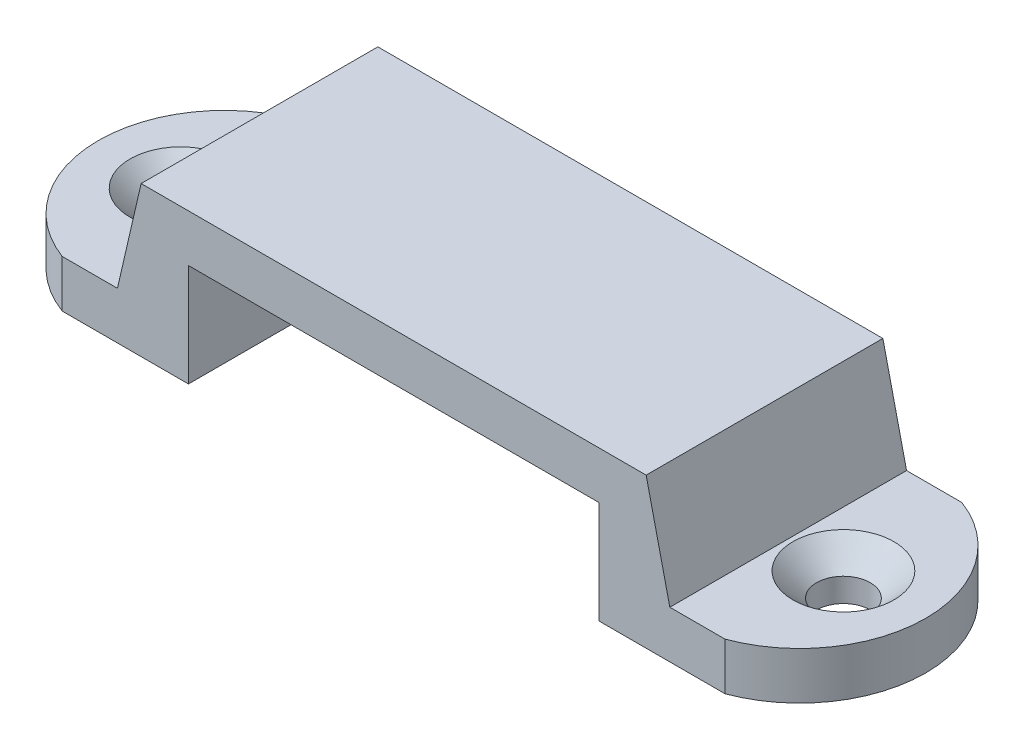
ISO-10303-21;
HEADER;
FILE_DESCRIPTION(('STEP AP214'),'2;1');
FILE_NAME('part.step','',(''),(''),'','','');
FILE_SCHEMA(('AUTOMOTIVE_DESIGN { 1 0 10303 214 1 1 1 1 }'));
ENDSEC;
DATA;
#1=APPLICATION_CONTEXT('core data for automotive mechanical design processes');
#2=APPLICATION_PROTOCOL_DEFINITION('international standard','automotive_design',2000,#1);
#3=PRODUCT_CONTEXT('',#1,'mechanical');
#4=PRODUCT('Part','Part','',(#3));
#5=PRODUCT_RELATED_PRODUCT_CATEGORY('part','',(#4));
#6=PRODUCT_DEFINITION_FORMATION('','',#4);
#7=PRODUCT_DEFINITION_CONTEXT('part definition',#1,'design');
#8=PRODUCT_DEFINITION('design','',#6,#7);
#9=PRODUCT_DEFINITION_SHAPE('','',#8);
#10=(LENGTH_UNIT() NAMED_UNIT(*) SI_UNIT(.MILLI.,.METRE.));
#11=(NAMED_UNIT(*) PLANE_ANGLE_UNIT() SI_UNIT($,.RADIAN.));
#12=(NAMED_UNIT(*) SI_UNIT($,.STERADIAN.) SOLID_ANGLE_UNIT());
#13=UNCERTAINTY_MEASURE_WITH_UNIT(LENGTH_MEASURE(1.E-05),#10,'distance_accuracy_value','');
#14=(GEOMETRIC_REPRESENTATION_CONTEXT(3) GLOBAL_UNCERTAINTY_ASSIGNED_CONTEXT((#13)) GLOBAL_UNIT_ASSIGNED_CONTEXT((#10,
#11,#12)) REPRESENTATION_CONTEXT('',''));
#15=CARTESIAN_POINT('',(0.,0.,0.));
#16=DIRECTION('',(0.,0.,1.));
#17=DIRECTION('',(1.,0.,0.));
#18=AXIS2_PLACEMENT_3D('',#15,#16,#17);
#19=CARTESIAN_POINT('',(4.5,-3.00000000000001,15.));
#20=DIRECTION('',(0.,1.,0.));
#21=DIRECTION('',(-1.,0.,0.));
#22=AXIS2_PLACEMENT_3D('',#19,#20,#21);
#23=PLANE('',#22);
#24=CARTESIAN_POINT('',(-3.5,-3.00000000000001,7.49999999999996));
#25=DIRECTION('',(0.,1.,0.));
#26=DIRECTION('',(-1.,0.,0.));
#27=AXIS2_PLACEMENT_3D('',#24,#25,#26);
#28=CIRCLE('',#27,1.69999999999999);
#29=CARTESIAN_POINT('',(-5.19999999999999,-3.00000000000001,7.49999999999996));
#30=VERTEX_POINT('',#29);
#31=EDGE_CURVE('E36',#30,#30,#28,.T.);
#32=ORIENTED_EDGE('',*,*,#31,.T.);
#33=EDGE_LOOP('',(#32));
#34=FACE_BOUND('',#33,.T.);
#35=DIRECTION('',(1.,0.,0.));
#36=VECTOR('',#35,1.);
#37=CARTESIAN_POINT('',(4.5,-3.00000000000001,0.));
#38=LINE('',#37,#36);
#39=CARTESIAN_POINT('',(-3.5,-3.00000000000001,0.));
#40=VERTEX_POINT('',#39);
#41=CARTESIAN_POINT('',(4.5,-3.00000000000001,0.));
#42=VERTEX_POINT('',#41);
#43=EDGE_CURVE('E148',#40,#42,#38,.T.);
#44=ORIENTED_EDGE('',*,*,#43,.T.);
#45=DIRECTION('',(0.,0.,-1.));
#46=VECTOR('',#45,1.);
#47=CARTESIAN_POINT('',(4.5,-3.00000000000001,15.));
#48=LINE('',#47,#46);
#49=CARTESIAN_POINT('',(4.5,-3.00000000000001,15.));
#50=VERTEX_POINT('',#49);
#51=EDGE_CURVE('E11',#50,#42,#48,.T.);
#52=ORIENTED_EDGE('',*,*,#51,.F.);
#53=DIRECTION('',(1.,0.,0.));
#54=VECTOR('',#53,1.);
#55=CARTESIAN_POINT('',(4.5,-3.00000000000001,15.));
#56=LINE('',#55,#54);
#57=CARTESIAN_POINT('',(-3.5,-3.00000000000001,15.));
#58=VERTEX_POINT('',#57);
#59=EDGE_CURVE('E173',#58,#50,#56,.T.);
#60=ORIENTED_EDGE('',*,*,#59,.F.);
#61=CARTESIAN_POINT('',(-0.716117818584988,-3.00000000000001,7.5));
#62=DIRECTION('',(0.,1.,0.));
#63=DIRECTION('',(-1.,0.,0.));
#64=AXIS2_PLACEMENT_3D('',#61,#62,#63);
#65=CIRCLE('',#64,8.);
#66=EDGE_CURVE('E152',#58,#40,#65,.F.);
#67=ORIENTED_EDGE('',*,*,#66,.T.);
#68=EDGE_LOOP('',(#44,#52,#60,#67));
#69=FACE_BOUND('',#68,.T.);
#70=ADVANCED_FACE('F33',(#34,#69),#23,.F.);
#71=CARTESIAN_POINT('',(4.5,3.49999999999999,15.));
#72=DIRECTION('',(-1.,0.,0.));
#73=DIRECTION('',(0.,-1.,0.));
#74=AXIS2_PLACEMENT_3D('',#71,#72,#73);
#75=PLANE('',#74);
#76=DIRECTION('',(0.,1.,0.));
#77=VECTOR('',#76,1.);
#78=CARTESIAN_POINT('',(4.5,3.49999999999999,0.));
#79=LINE('',#78,#77);
#80=CARTESIAN_POINT('',(4.5,3.49999999999999,0.));
#81=VERTEX_POINT('',#80);
#82=EDGE_CURVE('E151',#42,#81,#79,.T.);
#83=ORIENTED_EDGE('',*,*,#82,.T.);
#84=DIRECTION('',(0.,0.,-1.));
#85=VECTOR('',#84,1.);
#86=CARTESIAN_POINT('',(4.5,3.49999999999999,15.));
#87=LINE('',#86,#85);
#88=CARTESIAN_POINT('',(4.5,3.49999999999999,15.));
#89=VERTEX_POINT('',#88);
#90=EDGE_CURVE('E42',#89,#81,#87,.T.);
#91=ORIENTED_EDGE('',*,*,#90,.F.);
#92=DIRECTION('',(0.,1.,0.));
#93=VECTOR('',#92,1.);
#94=CARTESIAN_POINT('',(4.5,3.49999999999999,15.));
#95=LINE('',#94,#93);
#96=EDGE_CURVE('E102',#50,#89,#95,.T.);
#97=ORIENTED_EDGE('',*,*,#96,.F.);
#98=ORIENTED_EDGE('',*,*,#51,.T.);
#99=EDGE_LOOP('',(#83,#91,#97,#98));
#100=FACE_BOUND('',#99,.T.);
#101=ADVANCED_FACE('F267',(#100),#75,.F.);
#102=CARTESIAN_POINT('',(30.5,3.49999999999999,15.));
#103=DIRECTION('',(0.,1.,0.));
#104=DIRECTION('',(0.,0.,1.));
#105=AXIS2_PLACEMENT_3D('',#102,#103,#104);
#106=PLANE('',#105);
#107=DIRECTION('',(1.,0.,0.));
#108=VECTOR('',#107,1.);
#109=CARTESIAN_POINT('',(30.5,3.49999999999999,0.));
#110=LINE('',#109,#108);
#111=CARTESIAN_POINT('',(30.5,3.49999999999999,0.));
#112=VERTEX_POINT('',#111);
#113=EDGE_CURVE('E154',#81,#112,#110,.T.);
#114=ORIENTED_EDGE('',*,*,#113,.T.);
#115=DIRECTION('',(0.,0.,-1.));
#116=VECTOR('',#115,1.);
#117=CARTESIAN_POINT('',(30.5,3.49999999999999,15.));
#118=LINE('',#117,#116);
#119=CARTESIAN_POINT('',(30.5,3.49999999999999,15.));
#120=VERTEX_POINT('',#119);
#121=EDGE_CURVE('E185',#120,#112,#118,.T.);
#122=ORIENTED_EDGE('',*,*,#121,.F.);
#123=DIRECTION('',(1.,0.,0.));
#124=VECTOR('',#123,1.);
#125=CARTESIAN_POINT('',(30.5,3.49999999999999,15.));
#126=LINE('',#125,#124);
#127=EDGE_CURVE('E214',#89,#120,#126,.T.);
#128=ORIENTED_EDGE('',*,*,#127,.F.);
#129=ORIENTED_EDGE('',*,*,#90,.T.);
#130=EDGE_LOOP('',(#114,#122,#128,#129));
#131=FACE_BOUND('',#130,.T.);
#132=ADVANCED_FACE('F272',(#131),#106,.F.);
#133=CARTESIAN_POINT('',(30.5,-3.00000000000001,15.));
#134=DIRECTION('',(1.,0.,0.));
#135=DIRECTION('',(0.,0.,-1.));
#136=AXIS2_PLACEMENT_3D('',#133,#134,#135);
#137=PLANE('',#136);
#138=DIRECTION('',(0.,-1.,0.));
#139=VECTOR('',#138,1.);
#140=CARTESIAN_POINT('',(30.5,-3.00000000000001,0.));
#141=LINE('',#140,#139);
#142=CARTESIAN_POINT('',(30.5,-3.00000000000001,0.));
#143=VERTEX_POINT('',#142);
#144=EDGE_CURVE('E156',#112,#143,#141,.T.);
#145=ORIENTED_EDGE('',*,*,#144,.T.);
#146=DIRECTION('',(0.,0.,-1.));
#147=VECTOR('',#146,1.);
#148=CARTESIAN_POINT('',(30.5,-3.00000000000001,15.));
#149=LINE('',#148,#147);
#150=CARTESIAN_POINT('',(30.5,-3.00000000000001,15.));
#151=VERTEX_POINT('',#150);
#152=EDGE_CURVE('E182',#151,#143,#149,.T.);
#153=ORIENTED_EDGE('',*,*,#152,.F.);
#154=DIRECTION('',(0.,-1.,0.));
#155=VECTOR('',#154,1.);
#156=CARTESIAN_POINT('',(30.5,-3.00000000000001,15.));
#157=LINE('',#156,#155);
#158=EDGE_CURVE('E216',#120,#151,#157,.T.);
#159=ORIENTED_EDGE('',*,*,#158,.F.);
#160=ORIENTED_EDGE('',*,*,#121,.T.);
#161=EDGE_LOOP('',(#145,#153,#159,#160));
#162=FACE_BOUND('',#161,.T.);
#163=ADVANCED_FACE('F263',(#162),#137,.F.);
#164=CARTESIAN_POINT('',(38.5,-3.00000000000001,15.));
#165=DIRECTION('',(0.,1.,0.));
#166=DIRECTION('',(-1.,0.,0.));
#167=AXIS2_PLACEMENT_3D('',#164,#165,#166);
#168=PLANE('',#167);
#169=CARTESIAN_POINT('',(38.5,-3.00000000000001,7.5));
#170=DIRECTION('',(0.,1.,0.));
#171=DIRECTION('',(-1.,0.,0.));
#172=AXIS2_PLACEMENT_3D('',#169,#170,#171);
#173=CIRCLE('',#172,1.69999999999999);
#174=CARTESIAN_POINT('',(36.8,-3.00000000000001,7.5));
#175=VERTEX_POINT('',#174);
#176=EDGE_CURVE('E189',#175,#175,#173,.T.);
#177=ORIENTED_EDGE('',*,*,#176,.T.);
#178=EDGE_LOOP('',(#177));
#179=FACE_BOUND('',#178,.T.);
#180=DIRECTION('',(1.,0.,0.));
#181=VECTOR('',#180,1.);
#182=CARTESIAN_POINT('',(38.5,-3.00000000000001,0.));
#183=LINE('',#182,#181);
#184=CARTESIAN_POINT('',(38.5,-3.00000000000001,0.));
#185=VERTEX_POINT('',#184);
#186=EDGE_CURVE('E158',#143,#185,#183,.T.);
#187=ORIENTED_EDGE('',*,*,#186,.T.);
#188=CARTESIAN_POINT('',(35.716117818585,-3.00000000000001,7.5));
#189=DIRECTION('',(0.,1.,0.));
#190=DIRECTION('',(-1.,0.,0.));
#191=AXIS2_PLACEMENT_3D('',#188,#189,#190);
#192=CIRCLE('',#191,8.);
#193=CARTESIAN_POINT('',(38.5,-3.00000000000001,15.));
#194=VERTEX_POINT('',#193);
#195=EDGE_CURVE('E196',#185,#194,#192,.F.);
#196=ORIENTED_EDGE('',*,*,#195,.T.);
#197=DIRECTION('',(1.,0.,0.));
#198=VECTOR('',#197,1.);
#199=CARTESIAN_POINT('',(38.5,-3.00000000000001,15.));
#200=LINE('',#199,#198);
#201=EDGE_CURVE('E218',#151,#194,#200,.T.);
#202=ORIENTED_EDGE('',*,*,#201,.F.);
#203=ORIENTED_EDGE('',*,*,#152,.T.);
#204=EDGE_LOOP('',(#187,#196,#202,#203));
#205=FACE_BOUND('',#204,.T.);
#206=ADVANCED_FACE('F255',(#179,#205),#168,.F.);
#207=CARTESIAN_POINT('',(35.,0.,15.));
#208=DIRECTION('',(0.,-1.,0.));
#209=DIRECTION('',(1.,0.,0.));
#210=AXIS2_PLACEMENT_3D('',#207,#208,#209);
#211=PLANE('',#210);
#212=CARTESIAN_POINT('',(38.5,0.,7.5));
#213=DIRECTION('',(0.,1.,0.));
#214=DIRECTION('',(0.,0.,1.));
#215=AXIS2_PLACEMENT_3D('',#212,#213,#214);
#216=CIRCLE('',#215,3.2);
#217=CARTESIAN_POINT('',(38.5,0.,10.7));
#218=VERTEX_POINT('',#217);
#219=EDGE_CURVE('E199',#218,#218,#216,.T.);
#220=ORIENTED_EDGE('',*,*,#219,.F.);
#221=EDGE_LOOP('',(#220));
#222=FACE_BOUND('',#221,.T.);
#223=DIRECTION('',(-1.,0.,0.));
#224=VECTOR('',#223,1.);
#225=CARTESIAN_POINT('',(35.,0.,0.));
#226=LINE('',#225,#224);
#227=CARTESIAN_POINT('',(38.5,0.,0.));
#228=VERTEX_POINT('',#227);
#229=CARTESIAN_POINT('',(35.,0.,0.));
#230=VERTEX_POINT('',#229);
#231=EDGE_CURVE('E163',#228,#230,#226,.T.);
#232=ORIENTED_EDGE('',*,*,#231,.T.);
#233=DIRECTION('',(0.,0.,-1.));
#234=VECTOR('',#233,1.);
#235=CARTESIAN_POINT('',(35.,0.,15.));
#236=LINE('',#235,#234);
#237=CARTESIAN_POINT('',(35.,0.,15.));
#238=VERTEX_POINT('',#237);
#239=EDGE_CURVE('E179',#238,#230,#236,.T.);
#240=ORIENTED_EDGE('',*,*,#239,.F.);
#241=DIRECTION('',(-1.,0.,0.));
#242=VECTOR('',#241,1.);
#243=CARTESIAN_POINT('',(35.,0.,15.));
#244=LINE('',#243,#242);
#245=CARTESIAN_POINT('',(38.5,0.,15.));
#246=VERTEX_POINT('',#245);
#247=EDGE_CURVE('E222',#246,#238,#244,.T.);
#248=ORIENTED_EDGE('',*,*,#247,.F.);
#249=CARTESIAN_POINT('',(35.716117818585,0.,7.5));
#250=DIRECTION('',(0.,1.,0.));
#251=DIRECTION('',(0.,0.,-1.));
#252=AXIS2_PLACEMENT_3D('',#249,#250,#251);
#253=CIRCLE('',#252,8.);
#254=EDGE_CURVE('E191',#246,#228,#253,.T.);
#255=ORIENTED_EDGE('',*,*,#254,.T.);
#256=EDGE_LOOP('',(#232,#240,#248,#255));
#257=FACE_BOUND('',#256,.T.);
#258=ADVANCED_FACE('F253',(#222,#257),#211,.F.);
#259=CARTESIAN_POINT('',(33.5,6.49999999999999,15.));
#260=DIRECTION('',(-0.97439119569462,-0.224859506698758,0.));
#261=DIRECTION('',(0.224859506698758,-0.97439119569462,0.));
#262=AXIS2_PLACEMENT_3D('',#259,#260,#261);
#263=PLANE('',#262);
#264=DIRECTION('',(-0.224859506698758,0.97439119569462,0.));
#265=VECTOR('',#264,1.);
#266=CARTESIAN_POINT('',(33.5,6.49999999999999,0.));
#267=LINE('',#266,#265);
#268=CARTESIAN_POINT('',(33.5,6.49999999999999,0.));
#269=VERTEX_POINT('',#268);
#270=EDGE_CURVE('E165',#230,#269,#267,.T.);
#271=ORIENTED_EDGE('',*,*,#270,.T.);
#272=DIRECTION('',(0.,0.,-1.));
#273=VECTOR('',#272,1.);
#274=CARTESIAN_POINT('',(33.5,6.49999999999999,15.));
#275=LINE('',#274,#273);
#276=CARTESIAN_POINT('',(33.5,6.49999999999999,15.));
#277=VERTEX_POINT('',#276);
#278=EDGE_CURVE('E176',#277,#269,#275,.T.);
#279=ORIENTED_EDGE('',*,*,#278,.F.);
#280=DIRECTION('',(-0.224859506698758,0.97439119569462,0.));
#281=VECTOR('',#280,1.);
#282=CARTESIAN_POINT('',(33.5,6.49999999999999,15.));
#283=LINE('',#282,#281);
#284=EDGE_CURVE('E224',#238,#277,#283,.T.);
#285=ORIENTED_EDGE('',*,*,#284,.F.);
#286=ORIENTED_EDGE('',*,*,#239,.T.);
#287=EDGE_LOOP('',(#271,#279,#285,#286));
#288=FACE_BOUND('',#287,.T.);
#289=ADVANCED_FACE('F230',(#288),#263,.F.);
#290=CARTESIAN_POINT('',(1.5,6.49999999999999,15.));
#291=DIRECTION('',(0.,-1.,0.));
#292=DIRECTION('',(0.,0.,-1.));
#293=AXIS2_PLACEMENT_3D('',#290,#291,#292);
#294=PLANE('',#293);
#295=DIRECTION('',(-1.,0.,0.));
#296=VECTOR('',#295,1.);
#297=CARTESIAN_POINT('',(1.5,6.49999999999999,0.));
#298=LINE('',#297,#296);
#299=CARTESIAN_POINT('',(1.5,6.49999999999999,0.));
#300=VERTEX_POINT('',#299);
#301=EDGE_CURVE('E167',#269,#300,#298,.T.);
#302=ORIENTED_EDGE('',*,*,#301,.T.);
#303=DIRECTION('',(0.,0.,-1.));
#304=VECTOR('',#303,1.);
#305=CARTESIAN_POINT('',(1.5,6.49999999999999,15.));
#306=LINE('',#305,#304);
#307=CARTESIAN_POINT('',(1.5,6.49999999999999,15.));
#308=VERTEX_POINT('',#307);
#309=EDGE_CURVE('E139',#308,#300,#306,.T.);
#310=ORIENTED_EDGE('',*,*,#309,.F.);
#311=DIRECTION('',(-1.,0.,0.));
#312=VECTOR('',#311,1.);
#313=CARTESIAN_POINT('',(1.5,6.49999999999999,15.));
#314=LINE('',#313,#312);
#315=EDGE_CURVE('E134',#277,#308,#314,.T.);
#316=ORIENTED_EDGE('',*,*,#315,.F.);
#317=ORIENTED_EDGE('',*,*,#278,.T.);
#318=EDGE_LOOP('',(#302,#310,#316,#317));
#319=FACE_BOUND('',#318,.T.);
#320=ADVANCED_FACE('F234',(#319),#294,.F.);
#321=CARTESIAN_POINT('',(1.5,6.49999999999999,15.));
#322=DIRECTION('',(0.97439119569462,-0.224859506698758,0.));
#323=DIRECTION('',(0.224859506698758,0.97439119569462,0.));
#324=AXIS2_PLACEMENT_3D('',#321,#322,#323);
#325=PLANE('',#324);
#326=DIRECTION('',(-0.224859506698758,-0.97439119569462,0.));
#327=VECTOR('',#326,1.);
#328=CARTESIAN_POINT('',(1.5,6.49999999999999,0.));
#329=LINE('',#328,#327);
#330=CARTESIAN_POINT('',(0.,0.,0.));
#331=VERTEX_POINT('',#330);
#332=EDGE_CURVE('E87',#300,#331,#329,.T.);
#333=ORIENTED_EDGE('',*,*,#332,.T.);
#334=DIRECTION('',(0.,0.,-1.));
#335=VECTOR('',#334,1.);
#336=CARTESIAN_POINT('',(0.,0.,15.));
#337=LINE('',#336,#335);
#338=CARTESIAN_POINT('',(0.,0.,15.));
#339=VERTEX_POINT('',#338);
#340=EDGE_CURVE('E137',#339,#331,#337,.T.);
#341=ORIENTED_EDGE('',*,*,#340,.F.);
#342=DIRECTION('',(-0.224859506698758,-0.97439119569462,0.));
#343=VECTOR('',#342,1.);
#344=CARTESIAN_POINT('',(1.5,6.49999999999999,15.));
#345=LINE('',#344,#343);
#346=EDGE_CURVE('E129',#308,#339,#345,.T.);
#347=ORIENTED_EDGE('',*,*,#346,.F.);
#348=ORIENTED_EDGE('',*,*,#309,.T.);
#349=EDGE_LOOP('',(#333,#341,#347,#348));
#350=FACE_BOUND('',#349,.T.);
#351=ADVANCED_FACE('F138',(#350),#325,.F.);
#352=CARTESIAN_POINT('',(-3.5,0.,15.));
#353=DIRECTION('',(0.,-1.,0.));
#354=DIRECTION('',(0.,0.,-1.));
#355=AXIS2_PLACEMENT_3D('',#352,#353,#354);
#356=PLANE('',#355);
#357=CARTESIAN_POINT('',(-3.5,0.,7.49999999999996));
#358=DIRECTION('',(0.,1.,0.));
#359=DIRECTION('',(0.,0.,1.));
#360=AXIS2_PLACEMENT_3D('',#357,#358,#359);
#361=CIRCLE('',#360,3.2);
#362=CARTESIAN_POINT('',(-3.5,0.,10.7));
#363=VERTEX_POINT('',#362);
#364=EDGE_CURVE('E278',#363,#363,#361,.T.);
#365=ORIENTED_EDGE('',*,*,#364,.F.);
#366=EDGE_LOOP('',(#365));
#367=FACE_BOUND('',#366,.T.);
#368=DIRECTION('',(-1.,0.,0.));
#369=VECTOR('',#368,1.);
#370=CARTESIAN_POINT('',(-3.5,0.,0.));
#371=LINE('',#370,#369);
#372=CARTESIAN_POINT('',(-3.5,0.,0.));
#373=VERTEX_POINT('',#372);
#374=EDGE_CURVE('E94',#331,#373,#371,.T.);
#375=ORIENTED_EDGE('',*,*,#374,.T.);
#376=CARTESIAN_POINT('',(-0.716117818584988,0.,7.5));
#377=DIRECTION('',(0.,1.,0.));
#378=DIRECTION('',(0.,0.,1.));
#379=AXIS2_PLACEMENT_3D('',#376,#377,#378);
#380=CIRCLE('',#379,8.);
#381=CARTESIAN_POINT('',(-3.5,0.,15.));
#382=VERTEX_POINT('',#381);
#383=EDGE_CURVE('E143',#373,#382,#380,.T.);
#384=ORIENTED_EDGE('',*,*,#383,.T.);
#385=DIRECTION('',(-1.,0.,0.));
#386=VECTOR('',#385,1.);
#387=CARTESIAN_POINT('',(-3.5,0.,15.));
#388=LINE('',#387,#386);
#389=EDGE_CURVE('E132',#339,#382,#388,.T.);
#390=ORIENTED_EDGE('',*,*,#389,.F.);
#391=ORIENTED_EDGE('',*,*,#340,.T.);
#392=EDGE_LOOP('',(#375,#384,#390,#391));
#393=FACE_BOUND('',#392,.T.);
#394=ADVANCED_FACE('F141',(#367,#393),#356,.F.);
#395=CARTESIAN_POINT('',(0.,0.,15.));
#396=DIRECTION('',(0.,0.,-1.));
#397=DIRECTION('',(-1.,0.,0.));
#398=AXIS2_PLACEMENT_3D('',#395,#396,#397);
#399=PLANE('',#398);
#400=ORIENTED_EDGE('',*,*,#59,.T.);
#401=ORIENTED_EDGE('',*,*,#96,.T.);
#402=ORIENTED_EDGE('',*,*,#127,.T.);
#403=ORIENTED_EDGE('',*,*,#158,.T.);
#404=ORIENTED_EDGE('',*,*,#201,.T.);
#405=DIRECTION('',(0.,1.,0.));
#406=VECTOR('',#405,1.);
#407=CARTESIAN_POINT('',(38.5,0.,15.));
#408=LINE('',#407,#406);
#409=EDGE_CURVE('E220',#194,#246,#408,.T.);
#410=ORIENTED_EDGE('',*,*,#409,.T.);
#411=ORIENTED_EDGE('',*,*,#247,.T.);
#412=ORIENTED_EDGE('',*,*,#284,.T.);
#413=ORIENTED_EDGE('',*,*,#315,.T.);
#414=ORIENTED_EDGE('',*,*,#346,.T.);
#415=ORIENTED_EDGE('',*,*,#389,.T.);
#416=DIRECTION('',(0.,-1.,0.));
#417=VECTOR('',#416,1.);
#418=CARTESIAN_POINT('',(-3.5,-3.00000000000001,15.));
#419=LINE('',#418,#417);
#420=EDGE_CURVE('E51',#382,#58,#419,.T.);
#421=ORIENTED_EDGE('',*,*,#420,.T.);
#422=EDGE_LOOP('',(#400,#401,#402,#403,#404,#410,#411,#412,#413,#414,#415,#421));
#423=FACE_BOUND('',#422,.T.);
#424=ADVANCED_FACE('F130',(#423),#399,.F.);
#425=CARTESIAN_POINT('',(0.,0.,0.));
#426=DIRECTION('',(0.,0.,-1.));
#427=DIRECTION('',(-1.,0.,0.));
#428=AXIS2_PLACEMENT_3D('',#425,#426,#427);
#429=PLANE('',#428);
#430=ORIENTED_EDGE('',*,*,#43,.F.);
#431=DIRECTION('',(0.,-1.,0.));
#432=VECTOR('',#431,1.);
#433=CARTESIAN_POINT('',(-3.5,-3.00000000000001,0.));
#434=LINE('',#433,#432);
#435=EDGE_CURVE('E171',#373,#40,#434,.T.);
#436=ORIENTED_EDGE('',*,*,#435,.F.);
#437=ORIENTED_EDGE('',*,*,#374,.F.);
#438=ORIENTED_EDGE('',*,*,#332,.F.);
#439=ORIENTED_EDGE('',*,*,#301,.F.);
#440=ORIENTED_EDGE('',*,*,#270,.F.);
#441=ORIENTED_EDGE('',*,*,#231,.F.);
#442=DIRECTION('',(0.,1.,0.));
#443=VECTOR('',#442,1.);
#444=CARTESIAN_POINT('',(38.5,0.,0.));
#445=LINE('',#444,#443);
#446=EDGE_CURVE('E160',#185,#228,#445,.T.);
#447=ORIENTED_EDGE('',*,*,#446,.F.);
#448=ORIENTED_EDGE('',*,*,#186,.F.);
#449=ORIENTED_EDGE('',*,*,#144,.F.);
#450=ORIENTED_EDGE('',*,*,#113,.F.);
#451=ORIENTED_EDGE('',*,*,#82,.F.);
#452=EDGE_LOOP('',(#430,#436,#437,#438,#439,#440,#441,#447,#448,#449,#450,#451));
#453=FACE_BOUND('',#452,.T.);
#454=ADVANCED_FACE('F237',(#453),#429,.T.);
#455=CARTESIAN_POINT('',(-0.716117818584988,-18.8810542816703,7.5));
#456=DIRECTION('',(0.,1.,0.));
#457=DIRECTION('',(0.,0.,1.));
#458=AXIS2_PLACEMENT_3D('',#455,#456,#457);
#459=CYLINDRICAL_SURFACE('',#458,8.);
#460=ORIENTED_EDGE('',*,*,#66,.F.);
#461=ORIENTED_EDGE('',*,*,#420,.F.);
#462=ORIENTED_EDGE('',*,*,#383,.F.);
#463=ORIENTED_EDGE('',*,*,#435,.T.);
#464=EDGE_LOOP('',(#460,#461,#462,#463));
#465=FACE_BOUND('',#464,.T.);
#466=ADVANCED_FACE('F240',(#465),#459,.T.);
#467=CARTESIAN_POINT('',(35.716117818585,-18.8810542816703,7.5));
#468=DIRECTION('',(0.,1.,0.));
#469=DIRECTION('',(0.,0.,1.));
#470=AXIS2_PLACEMENT_3D('',#467,#468,#469);
#471=CYLINDRICAL_SURFACE('',#470,8.);
#472=ORIENTED_EDGE('',*,*,#195,.F.);
#473=ORIENTED_EDGE('',*,*,#446,.T.);
#474=ORIENTED_EDGE('',*,*,#254,.F.);
#475=ORIENTED_EDGE('',*,*,#409,.F.);
#476=EDGE_LOOP('',(#472,#473,#474,#475));
#477=FACE_BOUND('',#476,.T.);
#478=ADVANCED_FACE('F251',(#477),#471,.T.);
#479=CARTESIAN_POINT('',(38.5,0.,7.5));
#480=DIRECTION('',(0.,1.,0.));
#481=DIRECTION('',(0.,0.,1.));
#482=AXIS2_PLACEMENT_3D('',#479,#480,#481);
#483=CYLINDRICAL_SURFACE('',#482,1.69999999999999);
#484=CARTESIAN_POINT('',(38.5,-1.50000000000001,7.5));
#485=DIRECTION('',(0.,1.,0.));
#486=DIRECTION('',(0.,0.,1.));
#487=AXIS2_PLACEMENT_3D('',#484,#485,#486);
#488=CIRCLE('',#487,1.69999999999999);
#489=CARTESIAN_POINT('',(38.5,-1.50000000000001,9.19999999999999));
#490=VERTEX_POINT('',#489);
#491=EDGE_CURVE('E192',#490,#490,#488,.T.);
#492=ORIENTED_EDGE('',*,*,#491,.T.);
#493=EDGE_LOOP('',(#492));
#494=FACE_BOUND('',#493,.T.);
#495=ORIENTED_EDGE('',*,*,#176,.F.);
#496=EDGE_LOOP('',(#495));
#497=FACE_BOUND('',#496,.T.);
#498=ADVANCED_FACE('F338',(#494,#497),#483,.F.);
#499=CARTESIAN_POINT('',(38.5,0.,7.5));
#500=DIRECTION('',(0.,1.,0.));
#501=DIRECTION('',(0.,0.,1.));
#502=AXIS2_PLACEMENT_3D('',#499,#500,#501);
#503=CONICAL_SURFACE('',#502,3.2,0.785398163397448);
#504=ORIENTED_EDGE('',*,*,#491,.F.);
#505=EDGE_LOOP('',(#504));
#506=FACE_BOUND('',#505,.T.);
#507=ORIENTED_EDGE('',*,*,#219,.T.);
#508=EDGE_LOOP('',(#507));
#509=FACE_BOUND('',#508,.T.);
#510=ADVANCED_FACE('F368',(#506,#509),#503,.F.);
#511=CARTESIAN_POINT('',(-3.5,0.,7.49999999999996));
#512=DIRECTION('',(0.,1.,0.));
#513=DIRECTION('',(0.,0.,1.));
#514=AXIS2_PLACEMENT_3D('',#511,#512,#513);
#515=CYLINDRICAL_SURFACE('',#514,1.69999999999999);
#516=CARTESIAN_POINT('',(-3.5,-1.50000000000001,7.49999999999996));
#517=DIRECTION('',(0.,1.,0.));
#518=DIRECTION('',(0.,0.,1.));
#519=AXIS2_PLACEMENT_3D('',#516,#517,#518);
#520=CIRCLE('',#519,1.69999999999999);
#521=CARTESIAN_POINT('',(-3.5,-1.50000000000001,9.19999999999995));
#522=VERTEX_POINT('',#521);
#523=EDGE_CURVE('E276',#522,#522,#520,.T.);
#524=ORIENTED_EDGE('',*,*,#523,.T.);
#525=EDGE_LOOP('',(#524));
#526=FACE_BOUND('',#525,.T.);
#527=ORIENTED_EDGE('',*,*,#31,.F.);
#528=EDGE_LOOP('',(#527));
#529=FACE_BOUND('',#528,.T.);
#530=ADVANCED_FACE('F377',(#526,#529),#515,.F.);
#531=CARTESIAN_POINT('',(-3.5,0.,7.49999999999996));
#532=DIRECTION('',(0.,1.,0.));
#533=DIRECTION('',(0.,0.,1.));
#534=AXIS2_PLACEMENT_3D('',#531,#532,#533);
#535=CONICAL_SURFACE('',#534,3.2,0.785398163397448);
#536=ORIENTED_EDGE('',*,*,#523,.F.);
#537=EDGE_LOOP('',(#536));
#538=FACE_BOUND('',#537,.T.);
#539=ORIENTED_EDGE('',*,*,#364,.T.);
#540=EDGE_LOOP('',(#539));
#541=FACE_BOUND('',#540,.T.);
#542=ADVANCED_FACE('F285',(#538,#541),#535,.F.);
#543=CLOSED_SHELL('',(#70,#101,#132,#163,#206,#258,#289,#320,#351,#394,#424,#454,#466,#478,#498,
#510,#530,#542));
#544=MANIFOLD_SOLID_BREP('B2',#543);
#545=ADVANCED_BREP_SHAPE_REPRESENTATION('',(#18,#544),#14);
#546=SHAPE_DEFINITION_REPRESENTATION(#9,#545);
ENDSEC;
END-ISO-10303-21;
